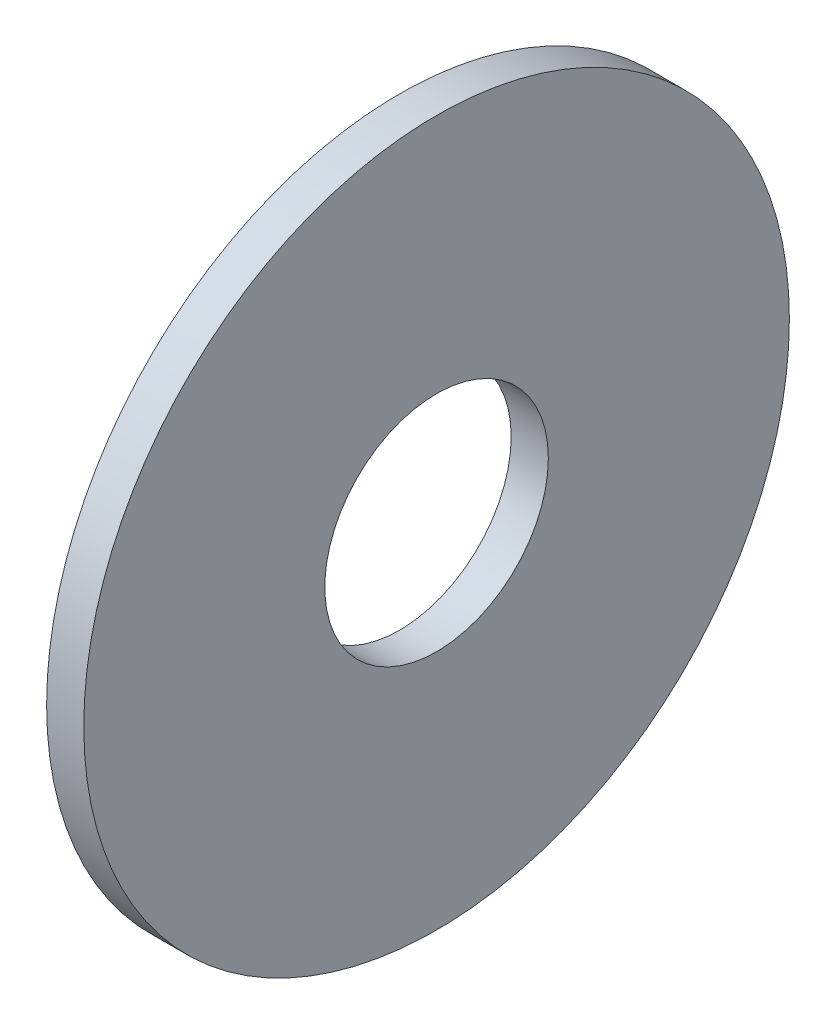
ISO-10303-21;
HEADER;
FILE_DESCRIPTION(('STEP AP214'),'2;1');
FILE_NAME('part.step','',(''),(''),'','','');
FILE_SCHEMA(('AUTOMOTIVE_DESIGN { 1 0 10303 214 1 1 1 1 }'));
ENDSEC;
DATA;
#1=APPLICATION_CONTEXT('core data for automotive mechanical design processes');
#2=APPLICATION_PROTOCOL_DEFINITION('international standard','automotive_design',2000,#1);
#3=PRODUCT_CONTEXT('',#1,'mechanical');
#4=PRODUCT('Part','Part','',(#3));
#5=PRODUCT_RELATED_PRODUCT_CATEGORY('part','',(#4));
#6=PRODUCT_DEFINITION_FORMATION('','',#4);
#7=PRODUCT_DEFINITION_CONTEXT('part definition',#1,'design');
#8=PRODUCT_DEFINITION('design','',#6,#7);
#9=PRODUCT_DEFINITION_SHAPE('','',#8);
#10=(LENGTH_UNIT() NAMED_UNIT(*) SI_UNIT(.MILLI.,.METRE.));
#11=(NAMED_UNIT(*) PLANE_ANGLE_UNIT() SI_UNIT($,.RADIAN.));
#12=(NAMED_UNIT(*) SI_UNIT($,.STERADIAN.) SOLID_ANGLE_UNIT());
#13=UNCERTAINTY_MEASURE_WITH_UNIT(LENGTH_MEASURE(1.E-05),#10,'distance_accuracy_value','');
#14=(GEOMETRIC_REPRESENTATION_CONTEXT(3) GLOBAL_UNCERTAINTY_ASSIGNED_CONTEXT((#13)) GLOBAL_UNIT_ASSIGNED_CONTEXT((#10,
#11,#12)) REPRESENTATION_CONTEXT('',''));
#15=CARTESIAN_POINT('',(0.,0.,0.));
#16=DIRECTION('',(0.,0.,1.));
#17=DIRECTION('',(1.,0.,0.));
#18=AXIS2_PLACEMENT_3D('',#15,#16,#17);
#19=CARTESIAN_POINT('',(0.499999999999975,0.,0.));
#20=DIRECTION('',(1.,0.,0.));
#21=DIRECTION('',(0.,0.,-1.));
#22=AXIS2_PLACEMENT_3D('',#19,#20,#21);
#23=PLANE('',#22);
#24=CARTESIAN_POINT('',(0.499999999999975,0.,0.));
#25=DIRECTION('',(1.,0.,0.));
#26=DIRECTION('',(0.,0.,-1.));
#27=AXIS2_PLACEMENT_3D('',#24,#25,#26);
#28=CIRCLE('',#27,9.49999999999999);
#29=CARTESIAN_POINT('',(0.499999999999975,0.,-9.49999999999999));
#30=VERTEX_POINT('',#29);
#31=EDGE_CURVE('E10',#30,#30,#28,.T.);
#32=ORIENTED_EDGE('',*,*,#31,.T.);
#33=EDGE_LOOP('',(#32));
#34=FACE_BOUND('',#33,.T.);
#35=CARTESIAN_POINT('',(0.499999999999975,0.,0.));
#36=DIRECTION('',(1.,0.,0.));
#37=DIRECTION('',(0.,0.,-1.));
#38=AXIS2_PLACEMENT_3D('',#35,#36,#37);
#39=CIRCLE('',#38,3.01);
#40=CARTESIAN_POINT('',(0.499999999999975,0.,-3.01));
#41=VERTEX_POINT('',#40);
#42=EDGE_CURVE('E47',#41,#41,#39,.T.);
#43=ORIENTED_EDGE('',*,*,#42,.F.);
#44=EDGE_LOOP('',(#43));
#45=FACE_BOUND('',#44,.T.);
#46=ADVANCED_FACE('F39',(#34,#45),#23,.T.);
#47=CARTESIAN_POINT('',(0.499999999999975,0.,0.));
#48=DIRECTION('',(-1.,0.,0.));
#49=DIRECTION('',(0.,0.,1.));
#50=AXIS2_PLACEMENT_3D('',#47,#48,#49);
#51=CYLINDRICAL_SURFACE('',#50,9.49999999999999);
#52=ORIENTED_EDGE('',*,*,#31,.F.);
#53=EDGE_LOOP('',(#52));
#54=FACE_BOUND('',#53,.T.);
#55=CARTESIAN_POINT('',(-0.500000000000025,0.,0.));
#56=DIRECTION('',(1.,0.,0.));
#57=DIRECTION('',(0.,0.,-1.));
#58=AXIS2_PLACEMENT_3D('',#55,#56,#57);
#59=CIRCLE('',#58,9.49999999999999);
#60=CARTESIAN_POINT('',(-0.500000000000025,0.,-9.49999999999999));
#61=VERTEX_POINT('',#60);
#62=EDGE_CURVE('E53',#61,#61,#59,.T.);
#63=ORIENTED_EDGE('',*,*,#62,.T.);
#64=EDGE_LOOP('',(#63));
#65=FACE_BOUND('',#64,.T.);
#66=ADVANCED_FACE('F41',(#54,#65),#51,.T.);
#67=CARTESIAN_POINT('',(0.499999999999975,0.,0.));
#68=DIRECTION('',(-1.,0.,0.));
#69=DIRECTION('',(0.,0.,1.));
#70=AXIS2_PLACEMENT_3D('',#67,#68,#69);
#71=CYLINDRICAL_SURFACE('',#70,3.01);
#72=ORIENTED_EDGE('',*,*,#42,.T.);
#73=EDGE_LOOP('',(#72));
#74=FACE_BOUND('',#73,.T.);
#75=CARTESIAN_POINT('',(-0.500000000000025,0.,0.));
#76=DIRECTION('',(1.,0.,0.));
#77=DIRECTION('',(0.,0.,-1.));
#78=AXIS2_PLACEMENT_3D('',#75,#76,#77);
#79=CIRCLE('',#78,3.01);
#80=CARTESIAN_POINT('',(-0.500000000000025,0.,-3.01));
#81=VERTEX_POINT('',#80);
#82=EDGE_CURVE('E59',#81,#81,#79,.T.);
#83=ORIENTED_EDGE('',*,*,#82,.F.);
#84=EDGE_LOOP('',(#83));
#85=FACE_BOUND('',#84,.T.);
#86=ADVANCED_FACE('F70',(#74,#85),#71,.F.);
#87=CARTESIAN_POINT('',(-0.500000000000025,0.,0.));
#88=DIRECTION('',(1.,0.,0.));
#89=DIRECTION('',(0.,0.,-1.));
#90=AXIS2_PLACEMENT_3D('',#87,#88,#89);
#91=PLANE('',#90);
#92=ORIENTED_EDGE('',*,*,#82,.T.);
#93=EDGE_LOOP('',(#92));
#94=FACE_BOUND('',#93,.T.);
#95=ORIENTED_EDGE('',*,*,#62,.F.);
#96=EDGE_LOOP('',(#95));
#97=FACE_BOUND('',#96,.T.);
#98=ADVANCED_FACE('F67',(#94,#97),#91,.F.);
#99=CLOSED_SHELL('',(#46,#66,#86,#98));
#100=MANIFOLD_SOLID_BREP('B2',#99);
#101=ADVANCED_BREP_SHAPE_REPRESENTATION('',(#18,#100),#14);
#102=SHAPE_DEFINITION_REPRESENTATION(#9,#101);
ENDSEC;
END-ISO-10303-21;
